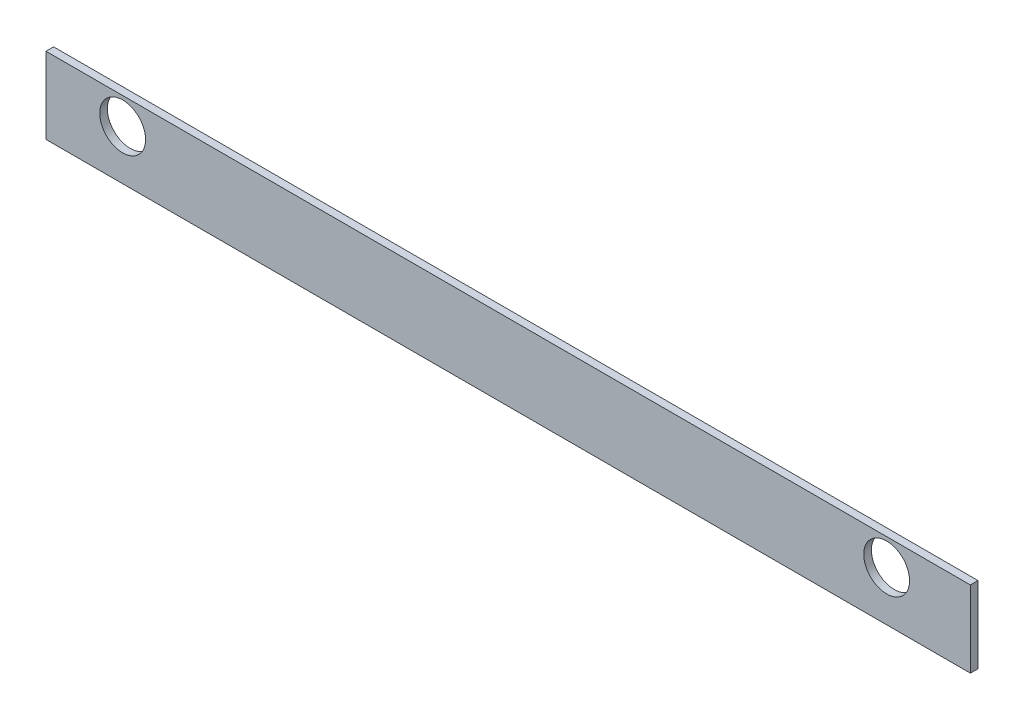
ISO-10303-21;
HEADER;
FILE_DESCRIPTION(('STEP AP214'),'2;1');
FILE_NAME('part.step','',(''),(''),'','','');
FILE_SCHEMA(('AUTOMOTIVE_DESIGN { 1 0 10303 214 1 1 1 1 }'));
ENDSEC;
DATA;
#1=APPLICATION_CONTEXT('core data for automotive mechanical design processes');
#2=APPLICATION_PROTOCOL_DEFINITION('international standard','automotive_design',2000,#1);
#3=PRODUCT_CONTEXT('',#1,'mechanical');
#4=PRODUCT('Part','Part','',(#3));
#5=PRODUCT_RELATED_PRODUCT_CATEGORY('part','',(#4));
#6=PRODUCT_DEFINITION_FORMATION('','',#4);
#7=PRODUCT_DEFINITION_CONTEXT('part definition',#1,'design');
#8=PRODUCT_DEFINITION('design','',#6,#7);
#9=PRODUCT_DEFINITION_SHAPE('','',#8);
#10=(LENGTH_UNIT() NAMED_UNIT(*) SI_UNIT(.MILLI.,.METRE.));
#11=(NAMED_UNIT(*) PLANE_ANGLE_UNIT() SI_UNIT($,.RADIAN.));
#12=(NAMED_UNIT(*) SI_UNIT($,.STERADIAN.) SOLID_ANGLE_UNIT());
#13=UNCERTAINTY_MEASURE_WITH_UNIT(LENGTH_MEASURE(1.E-05),#10,'distance_accuracy_value','');
#14=(GEOMETRIC_REPRESENTATION_CONTEXT(3) GLOBAL_UNCERTAINTY_ASSIGNED_CONTEXT((#13)) GLOBAL_UNIT_ASSIGNED_CONTEXT((#10,
#11,#12)) REPRESENTATION_CONTEXT('',''));
#15=CARTESIAN_POINT('',(0.,0.,0.));
#16=DIRECTION('',(0.,0.,1.));
#17=DIRECTION('',(1.,0.,0.));
#18=AXIS2_PLACEMENT_3D('',#15,#16,#17);
#19=CARTESIAN_POINT('',(0.,0.,10.));
#20=DIRECTION('',(0.,0.,1.));
#21=DIRECTION('',(1.,0.,0.));
#22=AXIS2_PLACEMENT_3D('',#19,#20,#21);
#23=PLANE('',#22);
#24=CARTESIAN_POINT('',(993.169555767828,-31.1919647072655,10.));
#25=DIRECTION('',(0.,0.,1.));
#26=DIRECTION('',(1.,0.,0.));
#27=AXIS2_PLACEMENT_3D('',#24,#25,#26);
#28=CIRCLE('',#27,30.0000000000002);
#29=CARTESIAN_POINT('',(1023.16955576783,-31.1919647072655,10.));
#30=VERTEX_POINT('',#29);
#31=EDGE_CURVE('E100',#30,#30,#28,.T.);
#32=ORIENTED_EDGE('',*,*,#31,.F.);
#33=EDGE_LOOP('',(#32));
#34=FACE_BOUND('',#33,.T.);
#35=DIRECTION('',(0.,-1.,0.));
#36=VECTOR('',#35,1.);
#37=CARTESIAN_POINT('',(-107.172976023401,3.80803529273453,10.));
#38=LINE('',#37,#36);
#39=CARTESIAN_POINT('',(-107.172976023401,3.80803529273453,10.));
#40=VERTEX_POINT('',#39);
#41=CARTESIAN_POINT('',(-107.172976023401,-96.1919647072655,10.));
#42=VERTEX_POINT('',#41);
#43=EDGE_CURVE('E85',#40,#42,#38,.T.);
#44=ORIENTED_EDGE('',*,*,#43,.T.);
#45=DIRECTION('',(1.,0.,0.));
#46=VECTOR('',#45,1.);
#47=CARTESIAN_POINT('',(-107.172976023401,-96.1919647072655,10.));
#48=LINE('',#47,#46);
#49=CARTESIAN_POINT('',(1102.71141847095,-96.1919647072655,10.));
#50=VERTEX_POINT('',#49);
#51=EDGE_CURVE('E80',#42,#50,#48,.T.);
#52=ORIENTED_EDGE('',*,*,#51,.T.);
#53=DIRECTION('',(0.,1.,0.));
#54=VECTOR('',#53,1.);
#55=CARTESIAN_POINT('',(1102.71141847095,3.80803529273453,10.));
#56=LINE('',#55,#54);
#57=CARTESIAN_POINT('',(1102.71141847095,3.80803529273453,10.));
#58=VERTEX_POINT('',#57);
#59=EDGE_CURVE('E83',#50,#58,#56,.T.);
#60=ORIENTED_EDGE('',*,*,#59,.T.);
#61=DIRECTION('',(-1.,0.,0.));
#62=VECTOR('',#61,1.);
#63=CARTESIAN_POINT('',(-107.172976023401,3.80803529273453,10.));
#64=LINE('',#63,#62);
#65=EDGE_CURVE('E50',#58,#40,#64,.T.);
#66=ORIENTED_EDGE('',*,*,#65,.T.);
#67=EDGE_LOOP('',(#44,#52,#60,#66));
#68=FACE_BOUND('',#67,.T.);
#69=CARTESIAN_POINT('',(-6.83044423217216,-31.1919647072656,10.));
#70=DIRECTION('',(0.,0.,1.));
#71=DIRECTION('',(1.,0.,0.));
#72=AXIS2_PLACEMENT_3D('',#69,#70,#71);
#73=CIRCLE('',#72,30.0000000000002);
#74=CARTESIAN_POINT('',(23.169555767828,-31.1919647072656,10.));
#75=VERTEX_POINT('',#74);
#76=EDGE_CURVE('E115',#75,#75,#73,.T.);
#77=ORIENTED_EDGE('',*,*,#76,.F.);
#78=EDGE_LOOP('',(#77));
#79=FACE_BOUND('',#78,.T.);
#80=ADVANCED_FACE('F33',(#34,#68,#79),#23,.T.);
#81=CARTESIAN_POINT('',(0.,0.,0.));
#82=DIRECTION('',(0.,0.,1.));
#83=DIRECTION('',(1.,0.,0.));
#84=AXIS2_PLACEMENT_3D('',#81,#82,#83);
#85=PLANE('',#84);
#86=DIRECTION('',(0.,-1.,0.));
#87=VECTOR('',#86,1.);
#88=CARTESIAN_POINT('',(-107.172976023401,3.80803529273453,0.));
#89=LINE('',#88,#87);
#90=CARTESIAN_POINT('',(-107.172976023401,3.80803529273453,0.));
#91=VERTEX_POINT('',#90);
#92=CARTESIAN_POINT('',(-107.172976023401,-96.1919647072655,0.));
#93=VERTEX_POINT('',#92);
#94=EDGE_CURVE('E97',#91,#93,#89,.T.);
#95=ORIENTED_EDGE('',*,*,#94,.F.);
#96=DIRECTION('',(-1.,0.,0.));
#97=VECTOR('',#96,1.);
#98=CARTESIAN_POINT('',(-107.172976023401,3.80803529273453,0.));
#99=LINE('',#98,#97);
#100=CARTESIAN_POINT('',(1102.71141847095,3.80803529273453,0.));
#101=VERTEX_POINT('',#100);
#102=EDGE_CURVE('E73',#101,#91,#99,.T.);
#103=ORIENTED_EDGE('',*,*,#102,.F.);
#104=DIRECTION('',(0.,1.,0.));
#105=VECTOR('',#104,1.);
#106=CARTESIAN_POINT('',(1102.71141847095,3.80803529273453,0.));
#107=LINE('',#106,#105);
#108=CARTESIAN_POINT('',(1102.71141847095,-96.1919647072655,0.));
#109=VERTEX_POINT('',#108);
#110=EDGE_CURVE('E67',#109,#101,#107,.T.);
#111=ORIENTED_EDGE('',*,*,#110,.F.);
#112=DIRECTION('',(1.,0.,0.));
#113=VECTOR('',#112,1.);
#114=CARTESIAN_POINT('',(-107.172976023401,-96.1919647072655,0.));
#115=LINE('',#114,#113);
#116=EDGE_CURVE('E89',#93,#109,#115,.T.);
#117=ORIENTED_EDGE('',*,*,#116,.F.);
#118=EDGE_LOOP('',(#95,#103,#111,#117));
#119=FACE_BOUND('',#118,.T.);
#120=CARTESIAN_POINT('',(993.169555767828,-31.1919647072655,0.));
#121=DIRECTION('',(0.,0.,1.));
#122=DIRECTION('',(1.,0.,0.));
#123=AXIS2_PLACEMENT_3D('',#120,#121,#122);
#124=CIRCLE('',#123,30.0000000000002);
#125=CARTESIAN_POINT('',(1023.16955576783,-31.1919647072655,0.));
#126=VERTEX_POINT('',#125);
#127=EDGE_CURVE('E112',#126,#126,#124,.T.);
#128=ORIENTED_EDGE('',*,*,#127,.T.);
#129=EDGE_LOOP('',(#128));
#130=FACE_BOUND('',#129,.T.);
#131=CARTESIAN_POINT('',(-6.83044423217216,-31.1919647072656,0.));
#132=DIRECTION('',(0.,0.,1.));
#133=DIRECTION('',(1.,0.,0.));
#134=AXIS2_PLACEMENT_3D('',#131,#132,#133);
#135=CIRCLE('',#134,30.0000000000002);
#136=CARTESIAN_POINT('',(23.169555767828,-31.1919647072656,0.));
#137=VERTEX_POINT('',#136);
#138=EDGE_CURVE('E118',#137,#137,#135,.T.);
#139=ORIENTED_EDGE('',*,*,#138,.T.);
#140=EDGE_LOOP('',(#139));
#141=FACE_BOUND('',#140,.T.);
#142=ADVANCED_FACE('F108',(#119,#130,#141),#85,.F.);
#143=CARTESIAN_POINT('',(-107.172976023401,3.80803529273453,10.));
#144=DIRECTION('',(1.,0.,0.));
#145=DIRECTION('',(0.,0.,-1.));
#146=AXIS2_PLACEMENT_3D('',#143,#144,#145);
#147=PLANE('',#146);
#148=ORIENTED_EDGE('',*,*,#94,.T.);
#149=DIRECTION('',(0.,0.,-1.));
#150=VECTOR('',#149,1.);
#151=CARTESIAN_POINT('',(-107.172976023401,-96.1919647072655,10.));
#152=LINE('',#151,#150);
#153=EDGE_CURVE('E11',#42,#93,#152,.T.);
#154=ORIENTED_EDGE('',*,*,#153,.F.);
#155=ORIENTED_EDGE('',*,*,#43,.F.);
#156=DIRECTION('',(0.,0.,-1.));
#157=VECTOR('',#156,1.);
#158=CARTESIAN_POINT('',(-107.172976023401,3.80803529273453,10.));
#159=LINE('',#158,#157);
#160=EDGE_CURVE('E93',#40,#91,#159,.T.);
#161=ORIENTED_EDGE('',*,*,#160,.T.);
#162=EDGE_LOOP('',(#148,#154,#155,#161));
#163=FACE_BOUND('',#162,.T.);
#164=ADVANCED_FACE('F35',(#163),#147,.F.);
#165=CARTESIAN_POINT('',(-107.172976023401,-96.1919647072655,10.));
#166=DIRECTION('',(0.,1.,0.));
#167=DIRECTION('',(0.,0.,1.));
#168=AXIS2_PLACEMENT_3D('',#165,#166,#167);
#169=PLANE('',#168);
#170=ORIENTED_EDGE('',*,*,#116,.T.);
#171=DIRECTION('',(0.,0.,-1.));
#172=VECTOR('',#171,1.);
#173=CARTESIAN_POINT('',(1102.71141847095,-96.1919647072655,10.));
#174=LINE('',#173,#172);
#175=EDGE_CURVE('E42',#50,#109,#174,.T.);
#176=ORIENTED_EDGE('',*,*,#175,.F.);
#177=ORIENTED_EDGE('',*,*,#51,.F.);
#178=ORIENTED_EDGE('',*,*,#153,.T.);
#179=EDGE_LOOP('',(#170,#176,#177,#178));
#180=FACE_BOUND('',#179,.T.);
#181=ADVANCED_FACE('F88',(#180),#169,.F.);
#182=CARTESIAN_POINT('',(1102.71141847095,3.80803529273453,10.));
#183=DIRECTION('',(-1.,0.,0.));
#184=DIRECTION('',(0.,0.,1.));
#185=AXIS2_PLACEMENT_3D('',#182,#183,#184);
#186=PLANE('',#185);
#187=ORIENTED_EDGE('',*,*,#110,.T.);
#188=DIRECTION('',(0.,0.,-1.));
#189=VECTOR('',#188,1.);
#190=CARTESIAN_POINT('',(1102.71141847095,3.80803529273453,10.));
#191=LINE('',#190,#189);
#192=EDGE_CURVE('E90',#58,#101,#191,.T.);
#193=ORIENTED_EDGE('',*,*,#192,.F.);
#194=ORIENTED_EDGE('',*,*,#59,.F.);
#195=ORIENTED_EDGE('',*,*,#175,.T.);
#196=EDGE_LOOP('',(#187,#193,#194,#195));
#197=FACE_BOUND('',#196,.T.);
#198=ADVANCED_FACE('F91',(#197),#186,.F.);
#199=CARTESIAN_POINT('',(-107.172976023401,3.80803529273453,10.));
#200=DIRECTION('',(0.,-1.,0.));
#201=DIRECTION('',(0.,0.,-1.));
#202=AXIS2_PLACEMENT_3D('',#199,#200,#201);
#203=PLANE('',#202);
#204=ORIENTED_EDGE('',*,*,#102,.T.);
#205=ORIENTED_EDGE('',*,*,#160,.F.);
#206=ORIENTED_EDGE('',*,*,#65,.F.);
#207=ORIENTED_EDGE('',*,*,#192,.T.);
#208=EDGE_LOOP('',(#204,#205,#206,#207));
#209=FACE_BOUND('',#208,.T.);
#210=ADVANCED_FACE('F105',(#209),#203,.F.);
#211=CARTESIAN_POINT('',(993.169555767828,-31.1919647072655,10.));
#212=DIRECTION('',(0.,0.,-1.));
#213=DIRECTION('',(-1.,0.,0.));
#214=AXIS2_PLACEMENT_3D('',#211,#212,#213);
#215=CYLINDRICAL_SURFACE('',#214,30.0000000000002);
#216=ORIENTED_EDGE('',*,*,#31,.T.);
#217=EDGE_LOOP('',(#216));
#218=FACE_BOUND('',#217,.T.);
#219=ORIENTED_EDGE('',*,*,#127,.F.);
#220=EDGE_LOOP('',(#219));
#221=FACE_BOUND('',#220,.T.);
#222=ADVANCED_FACE('F135',(#218,#221),#215,.F.);
#223=CARTESIAN_POINT('',(-6.83044423217216,-31.1919647072656,10.));
#224=DIRECTION('',(0.,0.,-1.));
#225=DIRECTION('',(-1.,0.,0.));
#226=AXIS2_PLACEMENT_3D('',#223,#224,#225);
#227=CYLINDRICAL_SURFACE('',#226,30.0000000000002);
#228=ORIENTED_EDGE('',*,*,#76,.T.);
#229=EDGE_LOOP('',(#228));
#230=FACE_BOUND('',#229,.T.);
#231=ORIENTED_EDGE('',*,*,#138,.F.);
#232=EDGE_LOOP('',(#231));
#233=FACE_BOUND('',#232,.T.);
#234=ADVANCED_FACE('F124',(#230,#233),#227,.F.);
#235=CLOSED_SHELL('',(#80,#142,#164,#181,#198,#210,#222,#234));
#236=MANIFOLD_SOLID_BREP('B2',#235);
#237=ADVANCED_BREP_SHAPE_REPRESENTATION('',(#18,#236),#14);
#238=SHAPE_DEFINITION_REPRESENTATION(#9,#237);
ENDSEC;
END-ISO-10303-21;
